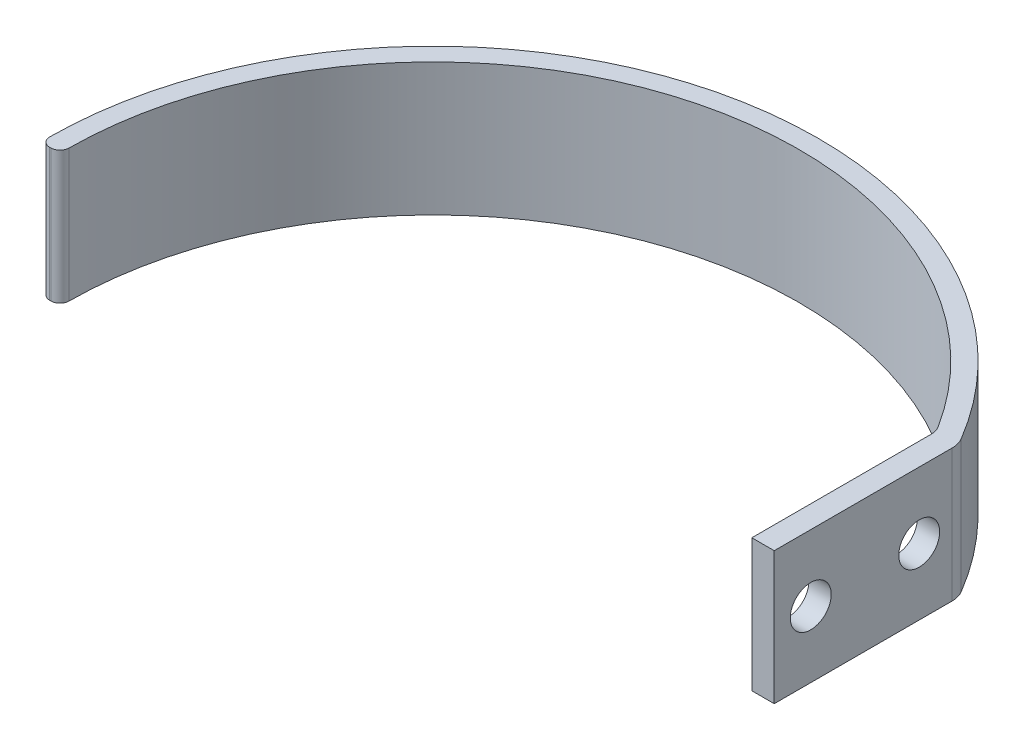
ISO-10303-21;
HEADER;
FILE_DESCRIPTION(('STEP AP214'),'2;1');
FILE_NAME('part.step','',(''),(''),'','','');
FILE_SCHEMA(('AUTOMOTIVE_DESIGN { 1 0 10303 214 1 1 1 1 }'));
ENDSEC;
DATA;
#1=APPLICATION_CONTEXT('core data for automotive mechanical design processes');
#2=APPLICATION_PROTOCOL_DEFINITION('international standard','automotive_design',2000,#1);
#3=PRODUCT_CONTEXT('',#1,'mechanical');
#4=PRODUCT('Part','Part','',(#3));
#5=PRODUCT_RELATED_PRODUCT_CATEGORY('part','',(#4));
#6=PRODUCT_DEFINITION_FORMATION('','',#4);
#7=PRODUCT_DEFINITION_CONTEXT('part definition',#1,'design');
#8=PRODUCT_DEFINITION('design','',#6,#7);
#9=PRODUCT_DEFINITION_SHAPE('','',#8);
#10=(LENGTH_UNIT() NAMED_UNIT(*) SI_UNIT(.MILLI.,.METRE.));
#11=(NAMED_UNIT(*) PLANE_ANGLE_UNIT() SI_UNIT($,.RADIAN.));
#12=(NAMED_UNIT(*) SI_UNIT($,.STERADIAN.) SOLID_ANGLE_UNIT());
#13=UNCERTAINTY_MEASURE_WITH_UNIT(LENGTH_MEASURE(1.E-05),#10,'distance_accuracy_value','');
#14=(GEOMETRIC_REPRESENTATION_CONTEXT(3) GLOBAL_UNCERTAINTY_ASSIGNED_CONTEXT((#13)) GLOBAL_UNIT_ASSIGNED_CONTEXT((#10,
#11,#12)) REPRESENTATION_CONTEXT('',''));
#15=CARTESIAN_POINT('',(0.,0.,0.));
#16=DIRECTION('',(0.,0.,1.));
#17=DIRECTION('',(1.,0.,0.));
#18=AXIS2_PLACEMENT_3D('',#15,#16,#17);
#19=CARTESIAN_POINT('',(25.9435363925625,0.,-0.53636566739179));
#20=DIRECTION('',(-1.,0.,0.));
#21=DIRECTION('',(0.,0.,1.));
#22=AXIS2_PLACEMENT_3D('',#19,#20,#21);
#23=PLANE('',#22);
#24=CARTESIAN_POINT('',(25.9435363925625,5.5,-12.5663656673918));
#25=DIRECTION('',(-1.,0.,0.));
#26=DIRECTION('',(0.,0.,1.));
#27=AXIS2_PLACEMENT_3D('',#24,#25,#26);
#28=CIRCLE('',#27,1.7);
#29=CARTESIAN_POINT('',(25.9435363925625,5.5,-10.8663656673918));
#30=VERTEX_POINT('',#29);
#31=EDGE_CURVE('E213',#30,#30,#28,.F.);
#32=ORIENTED_EDGE('',*,*,#31,.T.);
#33=EDGE_LOOP('',(#32));
#34=FACE_BOUND('',#33,.T.);
#35=DIRECTION('',(0.,0.,1.));
#36=VECTOR('',#35,1.);
#37=CARTESIAN_POINT('',(25.9435363925625,11.,-0.53636566739179));
#38=LINE('',#37,#36);
#39=CARTESIAN_POINT('',(25.9435363925625,11.,-15.4187290085269));
#40=VERTEX_POINT('',#39);
#41=CARTESIAN_POINT('',(25.9435363925625,11.,-0.53636566739179));
#42=VERTEX_POINT('',#41);
#43=EDGE_CURVE('E123',#40,#42,#38,.T.);
#44=ORIENTED_EDGE('',*,*,#43,.F.);
#45=DIRECTION('',(0.,-1.,0.));
#46=VECTOR('',#45,1.);
#47=CARTESIAN_POINT('',(25.9435363925625,0.,-15.4187290085269));
#48=LINE('',#47,#46);
#49=CARTESIAN_POINT('',(25.9435363925625,0.,-15.4187290085269));
#50=VERTEX_POINT('',#49);
#51=EDGE_CURVE('E141',#40,#50,#48,.T.);
#52=ORIENTED_EDGE('',*,*,#51,.T.);
#53=DIRECTION('',(0.,0.,1.));
#54=VECTOR('',#53,1.);
#55=CARTESIAN_POINT('',(25.9435363925625,0.,-0.53636566739179));
#56=LINE('',#55,#54);
#57=CARTESIAN_POINT('',(25.9435363925625,0.,-0.53636566739179));
#58=VERTEX_POINT('',#57);
#59=EDGE_CURVE('E201',#50,#58,#56,.T.);
#60=ORIENTED_EDGE('',*,*,#59,.T.);
#61=DIRECTION('',(0.,1.,0.));
#62=VECTOR('',#61,1.);
#63=CARTESIAN_POINT('',(25.9435363925625,0.,-0.53636566739179));
#64=LINE('',#63,#62);
#65=EDGE_CURVE('E128',#58,#42,#64,.T.);
#66=ORIENTED_EDGE('',*,*,#65,.T.);
#67=EDGE_LOOP('',(#44,#52,#60,#66));
#68=FACE_BOUND('',#67,.T.);
#69=CARTESIAN_POINT('',(25.9435363925625,5.5,-3.56636566739179));
#70=DIRECTION('',(-1.,0.,0.));
#71=DIRECTION('',(0.,0.,1.));
#72=AXIS2_PLACEMENT_3D('',#69,#70,#71);
#73=CIRCLE('',#72,1.7);
#74=CARTESIAN_POINT('',(25.9435363925625,5.5,-1.86636566739179));
#75=VERTEX_POINT('',#74);
#76=EDGE_CURVE('E116',#75,#75,#73,.F.);
#77=ORIENTED_EDGE('',*,*,#76,.T.);
#78=EDGE_LOOP('',(#77));
#79=FACE_BOUND('',#78,.T.);
#80=ADVANCED_FACE('F36',(#34,#68,#79),#23,.T.);
#81=CARTESIAN_POINT('',(-31.9955045572162,11.,0.536365667395811));
#82=DIRECTION('',(0.,0.,-1.));
#83=DIRECTION('',(-1.,0.,0.));
#84=AXIS2_PLACEMENT_3D('',#81,#82,#83);
#85=PLANE('',#84);
#86=DIRECTION('',(1.,0.,0.));
#87=VECTOR('',#86,1.);
#88=CARTESIAN_POINT('',(-31.9955045572162,11.,0.536365667395811));
#89=LINE('',#88,#87);
#90=CARTESIAN_POINT('',(-31.2492697574189,11.,0.536365667395811));
#91=VERTEX_POINT('',#90);
#92=CARTESIAN_POINT('',(-31.1495040199814,11.,0.536365667395811));
#93=VERTEX_POINT('',#92);
#94=EDGE_CURVE('E131',#91,#93,#89,.T.);
#95=ORIENTED_EDGE('',*,*,#94,.F.);
#96=DIRECTION('',(0.,-1.,0.));
#97=VECTOR('',#96,1.);
#98=CARTESIAN_POINT('',(-31.2492697574189,11.,0.536365667395811));
#99=LINE('',#98,#97);
#100=CARTESIAN_POINT('',(-31.2492697574189,0.,0.536365667395811));
#101=VERTEX_POINT('',#100);
#102=EDGE_CURVE('E151',#91,#101,#99,.T.);
#103=ORIENTED_EDGE('',*,*,#102,.T.);
#104=DIRECTION('',(1.,0.,0.));
#105=VECTOR('',#104,1.);
#106=CARTESIAN_POINT('',(-31.9955045572162,0.,0.536365667395811));
#107=LINE('',#106,#105);
#108=CARTESIAN_POINT('',(-31.1495040199814,0.,0.536365667395811));
#109=VERTEX_POINT('',#108);
#110=EDGE_CURVE('E133',#101,#109,#107,.T.);
#111=ORIENTED_EDGE('',*,*,#110,.T.);
#112=DIRECTION('',(0.,-1.,0.));
#113=VECTOR('',#112,1.);
#114=CARTESIAN_POINT('',(-31.1495040199814,11.,0.536365667395811));
#115=LINE('',#114,#113);
#116=EDGE_CURVE('E149',#109,#93,#115,.F.);
#117=ORIENTED_EDGE('',*,*,#116,.T.);
#118=EDGE_LOOP('',(#95,#103,#111,#117));
#119=FACE_BOUND('',#118,.T.);
#120=ADVANCED_FACE('F191',(#119),#85,.F.);
#121=CARTESIAN_POINT('',(0.,11.,0.));
#122=DIRECTION('',(0.,-1.,0.));
#123=DIRECTION('',(0.,0.,-1.));
#124=AXIS2_PLACEMENT_3D('',#121,#122,#123);
#125=CYLINDRICAL_SURFACE('',#124,30.4002366013311);
#126=CARTESIAN_POINT('',(0.,11.,0.));
#127=DIRECTION('',(0.,-1.,0.));
#128=DIRECTION('',(0.,0.,-1.));
#129=AXIS2_PLACEMENT_3D('',#126,#127,#128);
#130=CIRCLE('',#129,30.4002366013311);
#131=CARTESIAN_POINT('',(-30.3995216582427,11.,-0.208490687902424));
#132=VERTEX_POINT('',#131);
#133=CARTESIAN_POINT('',(25.7122216664801,11.,-16.2190025091156));
#134=VERTEX_POINT('',#133);
#135=EDGE_CURVE('E193',#132,#134,#130,.T.);
#136=ORIENTED_EDGE('',*,*,#135,.F.);
#137=DIRECTION('',(0.,-1.,0.));
#138=VECTOR('',#137,1.);
#139=CARTESIAN_POINT('',(-30.3995216582427,11.,-0.208490687902424));
#140=LINE('',#139,#138);
#141=CARTESIAN_POINT('',(-30.3995216582427,0.,-0.208490687902424));
#142=VERTEX_POINT('',#141);
#143=EDGE_CURVE('E166',#132,#142,#140,.T.);
#144=ORIENTED_EDGE('',*,*,#143,.T.);
#145=CARTESIAN_POINT('',(0.,0.,0.));
#146=DIRECTION('',(0.,-1.,0.));
#147=DIRECTION('',(0.,0.,-1.));
#148=AXIS2_PLACEMENT_3D('',#145,#146,#147);
#149=CIRCLE('',#148,30.4002366013311);
#150=CARTESIAN_POINT('',(25.7122216664801,0.,-16.2190025091156));
#151=VERTEX_POINT('',#150);
#152=EDGE_CURVE('E130',#142,#151,#149,.T.);
#153=ORIENTED_EDGE('',*,*,#152,.T.);
#154=DIRECTION('',(0.,-1.,0.));
#155=VECTOR('',#154,1.);
#156=CARTESIAN_POINT('',(25.7122216664801,11.,-16.2190025091156));
#157=LINE('',#156,#155);
#158=EDGE_CURVE('E138',#151,#134,#157,.F.);
#159=ORIENTED_EDGE('',*,*,#158,.T.);
#160=EDGE_LOOP('',(#136,#144,#153,#159));
#161=FACE_BOUND('',#160,.T.);
#162=ADVANCED_FACE('F245',(#161),#125,.F.);
#163=CARTESIAN_POINT('',(31.9955045572164,11.,-0.536365667391791));
#164=DIRECTION('',(0.,0.,1.));
#165=DIRECTION('',(1.,0.,0.));
#166=AXIS2_PLACEMENT_3D('',#163,#164,#165);
#167=PLANE('',#166);
#168=DIRECTION('',(0.,1.,0.));
#169=VECTOR('',#168,1.);
#170=CARTESIAN_POINT('',(27.8009477380774,-0.000999999999999265,-0.536365667391791));
#171=LINE('',#170,#169);
#172=CARTESIAN_POINT('',(27.8009477380774,0.,-0.53636566739179));
#173=VERTEX_POINT('',#172);
#174=CARTESIAN_POINT('',(27.8009477380774,11.,-0.536365667391791));
#175=VERTEX_POINT('',#174);
#176=EDGE_CURVE('E119',#173,#175,#171,.T.);
#177=ORIENTED_EDGE('',*,*,#176,.T.);
#178=DIRECTION('',(-1.,0.,0.));
#179=VECTOR('',#178,1.);
#180=CARTESIAN_POINT('',(31.9955045572164,11.,-0.536365667391791));
#181=LINE('',#180,#179);
#182=EDGE_CURVE('E195',#175,#42,#181,.T.);
#183=ORIENTED_EDGE('',*,*,#182,.T.);
#184=ORIENTED_EDGE('',*,*,#65,.F.);
#185=DIRECTION('',(-1.,0.,0.));
#186=VECTOR('',#185,1.);
#187=CARTESIAN_POINT('',(31.9955045572164,0.,-0.536365667391791));
#188=LINE('',#187,#186);
#189=EDGE_CURVE('E113',#173,#58,#188,.T.);
#190=ORIENTED_EDGE('',*,*,#189,.F.);
#191=EDGE_LOOP('',(#177,#183,#184,#190));
#192=FACE_BOUND('',#191,.T.);
#193=ADVANCED_FACE('F126',(#192),#167,.T.);
#194=CARTESIAN_POINT('',(0.,11.,0.));
#195=DIRECTION('',(0.,-1.,0.));
#196=DIRECTION('',(0.,0.,-1.));
#197=AXIS2_PLACEMENT_3D('',#194,#195,#196);
#198=CYLINDRICAL_SURFACE('',#197,32.0000000000001);
#199=CARTESIAN_POINT('',(0.,11.,0.));
#200=DIRECTION('',(0.,1.,0.));
#201=DIRECTION('',(0.,0.,1.));
#202=AXIS2_PLACEMENT_3D('',#199,#200,#201);
#203=CIRCLE('',#202,32.0000000000001);
#204=CARTESIAN_POINT('',(27.5210109206159,11.,-16.3277052247811));
#205=VERTEX_POINT('',#204);
#206=CARTESIAN_POINT('',(-31.999252231597,11.,-0.218761556586689));
#207=VERTEX_POINT('',#206);
#208=EDGE_CURVE('E142',#205,#207,#203,.T.);
#209=ORIENTED_EDGE('',*,*,#208,.F.);
#210=DIRECTION('',(0.,-1.,0.));
#211=VECTOR('',#210,1.);
#212=CARTESIAN_POINT('',(27.5210109206159,11.,-16.3277052247811));
#213=LINE('',#212,#211);
#214=CARTESIAN_POINT('',(27.5210109206159,0.,-16.3277052247811));
#215=VERTEX_POINT('',#214);
#216=EDGE_CURVE('E169',#205,#215,#213,.T.);
#217=ORIENTED_EDGE('',*,*,#216,.T.);
#218=CARTESIAN_POINT('',(0.,0.,0.));
#219=DIRECTION('',(0.,1.,0.));
#220=DIRECTION('',(0.,0.,1.));
#221=AXIS2_PLACEMENT_3D('',#218,#219,#220);
#222=CIRCLE('',#221,32.0000000000001);
#223=CARTESIAN_POINT('',(-31.999252231597,0.,-0.218761556586689));
#224=VERTEX_POINT('',#223);
#225=EDGE_CURVE('E129',#215,#224,#222,.T.);
#226=ORIENTED_EDGE('',*,*,#225,.T.);
#227=DIRECTION('',(0.,-1.,0.));
#228=VECTOR('',#227,1.);
#229=CARTESIAN_POINT('',(-31.999252231597,11.,-0.218761556586689));
#230=LINE('',#229,#228);
#231=EDGE_CURVE('E159',#224,#207,#230,.F.);
#232=ORIENTED_EDGE('',*,*,#231,.T.);
#233=EDGE_LOOP('',(#209,#217,#226,#232));
#234=FACE_BOUND('',#233,.T.);
#235=ADVANCED_FACE('F175',(#234),#198,.T.);
#236=CARTESIAN_POINT('',(0.,11.,0.));
#237=DIRECTION('',(0.,-1.,0.));
#238=DIRECTION('',(0.,0.,-1.));
#239=AXIS2_PLACEMENT_3D('',#236,#237,#238);
#240=PLANE('',#239);
#241=DIRECTION('',(0.,0.,1.));
#242=VECTOR('',#241,1.);
#243=CARTESIAN_POINT('',(27.8009477380774,11.,-15.8463656673918));
#244=LINE('',#243,#242);
#245=CARTESIAN_POINT('',(27.8009477380774,11.,-15.3072236482323));
#246=VERTEX_POINT('',#245);
#247=EDGE_CURVE('E115',#246,#175,#244,.T.);
#248=ORIENTED_EDGE('',*,*,#247,.F.);
#249=CARTESIAN_POINT('',(25.8009477380774,11.,-15.3072236482323));
#250=DIRECTION('',(0.,-1.,0.));
#251=DIRECTION('',(0.,0.,-1.));
#252=AXIS2_PLACEMENT_3D('',#249,#250,#251);
#253=CIRCLE('',#252,2.);
#254=EDGE_CURVE('E12',#246,#205,#253,.F.);
#255=ORIENTED_EDGE('',*,*,#254,.T.);
#256=ORIENTED_EDGE('',*,*,#208,.T.);
#257=CARTESIAN_POINT('',(-31.2492697574189,11.,-0.213634332604189));
#258=DIRECTION('',(0.,-1.,0.));
#259=DIRECTION('',(0.,0.,-1.));
#260=AXIS2_PLACEMENT_3D('',#257,#258,#259);
#261=CIRCLE('',#260,0.75);
#262=EDGE_CURVE('E164',#207,#91,#261,.F.);
#263=ORIENTED_EDGE('',*,*,#262,.T.);
#264=ORIENTED_EDGE('',*,*,#94,.T.);
#265=CARTESIAN_POINT('',(-31.1495040199814,11.,-0.213634332604189));
#266=DIRECTION('',(0.,-1.,0.));
#267=DIRECTION('',(0.,0.,-1.));
#268=AXIS2_PLACEMENT_3D('',#265,#266,#267);
#269=CIRCLE('',#268,0.75);
#270=EDGE_CURVE('E162',#93,#132,#269,.F.);
#271=ORIENTED_EDGE('',*,*,#270,.T.);
#272=ORIENTED_EDGE('',*,*,#135,.T.);
#273=CARTESIAN_POINT('',(24.4435363925625,11.,-15.4187290085269));
#274=DIRECTION('',(0.,-1.,0.));
#275=DIRECTION('',(0.,0.,-1.));
#276=AXIS2_PLACEMENT_3D('',#273,#274,#275);
#277=CIRCLE('',#276,1.5);
#278=EDGE_CURVE('E144',#134,#40,#277,.T.);
#279=ORIENTED_EDGE('',*,*,#278,.T.);
#280=ORIENTED_EDGE('',*,*,#43,.T.);
#281=ORIENTED_EDGE('',*,*,#182,.F.);
#282=EDGE_LOOP('',(#248,#255,#256,#263,#264,#271,#272,#279,#280,#281));
#283=FACE_BOUND('',#282,.T.);
#284=ADVANCED_FACE('F188',(#283),#240,.F.);
#285=CARTESIAN_POINT('',(0.,0.,0.));
#286=DIRECTION('',(0.,-1.,0.));
#287=DIRECTION('',(0.,0.,-1.));
#288=AXIS2_PLACEMENT_3D('',#285,#286,#287);
#289=PLANE('',#288);
#290=ORIENTED_EDGE('',*,*,#225,.F.);
#291=CARTESIAN_POINT('',(25.8009477380774,0.,-15.3072236482323));
#292=DIRECTION('',(0.,-1.,0.));
#293=DIRECTION('',(0.,0.,-1.));
#294=AXIS2_PLACEMENT_3D('',#291,#292,#293);
#295=CIRCLE('',#294,2.);
#296=CARTESIAN_POINT('',(27.8009477380774,0.,-15.3072236482323));
#297=VERTEX_POINT('',#296);
#298=EDGE_CURVE('E58',#215,#297,#295,.T.);
#299=ORIENTED_EDGE('',*,*,#298,.T.);
#300=DIRECTION('',(0.,0.,1.));
#301=VECTOR('',#300,1.);
#302=CARTESIAN_POINT('',(27.8009477380774,0.,-15.8463656673918));
#303=LINE('',#302,#301);
#304=EDGE_CURVE('E108',#297,#173,#303,.T.);
#305=ORIENTED_EDGE('',*,*,#304,.T.);
#306=ORIENTED_EDGE('',*,*,#189,.T.);
#307=ORIENTED_EDGE('',*,*,#59,.F.);
#308=CARTESIAN_POINT('',(24.4435363925625,0.,-15.4187290085269));
#309=DIRECTION('',(0.,-1.,0.));
#310=DIRECTION('',(0.,0.,-1.));
#311=AXIS2_PLACEMENT_3D('',#308,#309,#310);
#312=CIRCLE('',#311,1.5);
#313=EDGE_CURVE('E146',#50,#151,#312,.F.);
#314=ORIENTED_EDGE('',*,*,#313,.T.);
#315=ORIENTED_EDGE('',*,*,#152,.F.);
#316=CARTESIAN_POINT('',(-31.1495040199814,0.,-0.213634332604189));
#317=DIRECTION('',(0.,-1.,0.));
#318=DIRECTION('',(0.,0.,-1.));
#319=AXIS2_PLACEMENT_3D('',#316,#317,#318);
#320=CIRCLE('',#319,0.75);
#321=EDGE_CURVE('E154',#142,#109,#320,.T.);
#322=ORIENTED_EDGE('',*,*,#321,.T.);
#323=ORIENTED_EDGE('',*,*,#110,.F.);
#324=CARTESIAN_POINT('',(-31.2492697574189,0.,-0.213634332604189));
#325=DIRECTION('',(0.,-1.,0.));
#326=DIRECTION('',(0.,0.,-1.));
#327=AXIS2_PLACEMENT_3D('',#324,#325,#326);
#328=CIRCLE('',#327,0.75);
#329=EDGE_CURVE('E156',#101,#224,#328,.T.);
#330=ORIENTED_EDGE('',*,*,#329,.T.);
#331=EDGE_LOOP('',(#290,#299,#305,#306,#307,#314,#315,#322,#323,#330));
#332=FACE_BOUND('',#331,.T.);
#333=ADVANCED_FACE('F110',(#332),#289,.T.);
#334=CARTESIAN_POINT('',(24.4435363925625,11.,-15.4187290085269));
#335=DIRECTION('',(0.,-1.,0.));
#336=DIRECTION('',(0.,0.,-1.));
#337=AXIS2_PLACEMENT_3D('',#334,#335,#336);
#338=CYLINDRICAL_SURFACE('',#337,1.5);
#339=ORIENTED_EDGE('',*,*,#313,.F.);
#340=ORIENTED_EDGE('',*,*,#51,.F.);
#341=ORIENTED_EDGE('',*,*,#278,.F.);
#342=ORIENTED_EDGE('',*,*,#158,.F.);
#343=EDGE_LOOP('',(#339,#340,#341,#342));
#344=FACE_BOUND('',#343,.T.);
#345=ADVANCED_FACE('F252',(#344),#338,.F.);
#346=CARTESIAN_POINT('',(-31.2492697574189,11.,-0.213634332604189));
#347=DIRECTION('',(0.,-1.,0.));
#348=DIRECTION('',(0.,0.,-1.));
#349=AXIS2_PLACEMENT_3D('',#346,#347,#348);
#350=CYLINDRICAL_SURFACE('',#349,0.75);
#351=ORIENTED_EDGE('',*,*,#262,.F.);
#352=ORIENTED_EDGE('',*,*,#231,.F.);
#353=ORIENTED_EDGE('',*,*,#329,.F.);
#354=ORIENTED_EDGE('',*,*,#102,.F.);
#355=EDGE_LOOP('',(#351,#352,#353,#354));
#356=FACE_BOUND('',#355,.T.);
#357=ADVANCED_FACE('F184',(#356),#350,.T.);
#358=CARTESIAN_POINT('',(-31.1495040199814,11.,-0.213634332604189));
#359=DIRECTION('',(0.,-1.,0.));
#360=DIRECTION('',(0.,0.,-1.));
#361=AXIS2_PLACEMENT_3D('',#358,#359,#360);
#362=CYLINDRICAL_SURFACE('',#361,0.75);
#363=ORIENTED_EDGE('',*,*,#270,.F.);
#364=ORIENTED_EDGE('',*,*,#116,.F.);
#365=ORIENTED_EDGE('',*,*,#321,.F.);
#366=ORIENTED_EDGE('',*,*,#143,.F.);
#367=EDGE_LOOP('',(#363,#364,#365,#366));
#368=FACE_BOUND('',#367,.T.);
#369=ADVANCED_FACE('F224',(#368),#362,.T.);
#370=CARTESIAN_POINT('',(27.8009477380774,-0.000999999999999265,-15.8463656673918));
#371=DIRECTION('',(-1.,0.,0.));
#372=DIRECTION('',(0.,0.,1.));
#373=AXIS2_PLACEMENT_3D('',#370,#371,#372);
#374=PLANE('',#373);
#375=CARTESIAN_POINT('',(27.8009477380774,5.5,-12.5663656673918));
#376=DIRECTION('',(1.,0.,0.));
#377=DIRECTION('',(0.,0.,-1.));
#378=AXIS2_PLACEMENT_3D('',#375,#376,#377);
#379=CIRCLE('',#378,1.7);
#380=CARTESIAN_POINT('',(27.8009477380774,5.5,-14.2663656673918));
#381=VERTEX_POINT('',#380);
#382=EDGE_CURVE('E216',#381,#381,#379,.T.);
#383=ORIENTED_EDGE('',*,*,#382,.F.);
#384=EDGE_LOOP('',(#383));
#385=FACE_BOUND('',#384,.T.);
#386=CARTESIAN_POINT('',(27.8009477380774,5.5,-3.56636566739179));
#387=DIRECTION('',(1.,0.,0.));
#388=DIRECTION('',(0.,0.,-1.));
#389=AXIS2_PLACEMENT_3D('',#386,#387,#388);
#390=CIRCLE('',#389,1.7);
#391=CARTESIAN_POINT('',(27.8009477380774,5.5,-5.26636566739179));
#392=VERTEX_POINT('',#391);
#393=EDGE_CURVE('E210',#392,#392,#390,.T.);
#394=ORIENTED_EDGE('',*,*,#393,.F.);
#395=EDGE_LOOP('',(#394));
#396=FACE_BOUND('',#395,.T.);
#397=ORIENTED_EDGE('',*,*,#304,.F.);
#398=DIRECTION('',(0.,-1.,0.));
#399=VECTOR('',#398,1.);
#400=CARTESIAN_POINT('',(27.8009477380774,-0.000999999999999265,-15.3072236482323));
#401=LINE('',#400,#399);
#402=EDGE_CURVE('E44',#297,#246,#401,.F.);
#403=ORIENTED_EDGE('',*,*,#402,.T.);
#404=ORIENTED_EDGE('',*,*,#247,.T.);
#405=ORIENTED_EDGE('',*,*,#176,.F.);
#406=EDGE_LOOP('',(#397,#403,#404,#405));
#407=FACE_BOUND('',#406,.T.);
#408=ADVANCED_FACE('F120',(#385,#396,#407),#374,.F.);
#409=CARTESIAN_POINT('',(25.8009477380774,11.,-15.3072236482323));
#410=DIRECTION('',(0.,-1.,0.));
#411=DIRECTION('',(0.,0.,-1.));
#412=AXIS2_PLACEMENT_3D('',#409,#410,#411);
#413=CYLINDRICAL_SURFACE('',#412,2.);
#414=ORIENTED_EDGE('',*,*,#254,.F.);
#415=ORIENTED_EDGE('',*,*,#402,.F.);
#416=ORIENTED_EDGE('',*,*,#298,.F.);
#417=ORIENTED_EDGE('',*,*,#216,.F.);
#418=EDGE_LOOP('',(#414,#415,#416,#417));
#419=FACE_BOUND('',#418,.T.);
#420=ADVANCED_FACE('F38',(#419),#413,.T.);
#421=CARTESIAN_POINT('',(27.8009477380774,5.5,-3.56636566739179));
#422=DIRECTION('',(1.,0.,0.));
#423=DIRECTION('',(0.,0.,-1.));
#424=AXIS2_PLACEMENT_3D('',#421,#422,#423);
#425=CYLINDRICAL_SURFACE('',#424,1.7);
#426=ORIENTED_EDGE('',*,*,#76,.F.);
#427=EDGE_LOOP('',(#426));
#428=FACE_BOUND('',#427,.T.);
#429=ORIENTED_EDGE('',*,*,#393,.T.);
#430=EDGE_LOOP('',(#429));
#431=FACE_BOUND('',#430,.T.);
#432=ADVANCED_FACE('F228',(#428,#431),#425,.F.);
#433=CARTESIAN_POINT('',(27.8009477380774,5.5,-12.5663656673918));
#434=DIRECTION('',(1.,0.,0.));
#435=DIRECTION('',(0.,0.,-1.));
#436=AXIS2_PLACEMENT_3D('',#433,#434,#435);
#437=CYLINDRICAL_SURFACE('',#436,1.7);
#438=ORIENTED_EDGE('',*,*,#31,.F.);
#439=EDGE_LOOP('',(#438));
#440=FACE_BOUND('',#439,.T.);
#441=ORIENTED_EDGE('',*,*,#382,.T.);
#442=EDGE_LOOP('',(#441));
#443=FACE_BOUND('',#442,.T.);
#444=ADVANCED_FACE('F220',(#440,#443),#437,.F.);
#445=CLOSED_SHELL('',(#80,#120,#162,#193,#235,#284,#333,#345,#357,#369,#408,#420,#432,#444));
#446=MANIFOLD_SOLID_BREP('B2',#445);
#447=ADVANCED_BREP_SHAPE_REPRESENTATION('',(#18,#446),#14);
#448=SHAPE_DEFINITION_REPRESENTATION(#9,#447);
ENDSEC;
END-ISO-10303-21;
